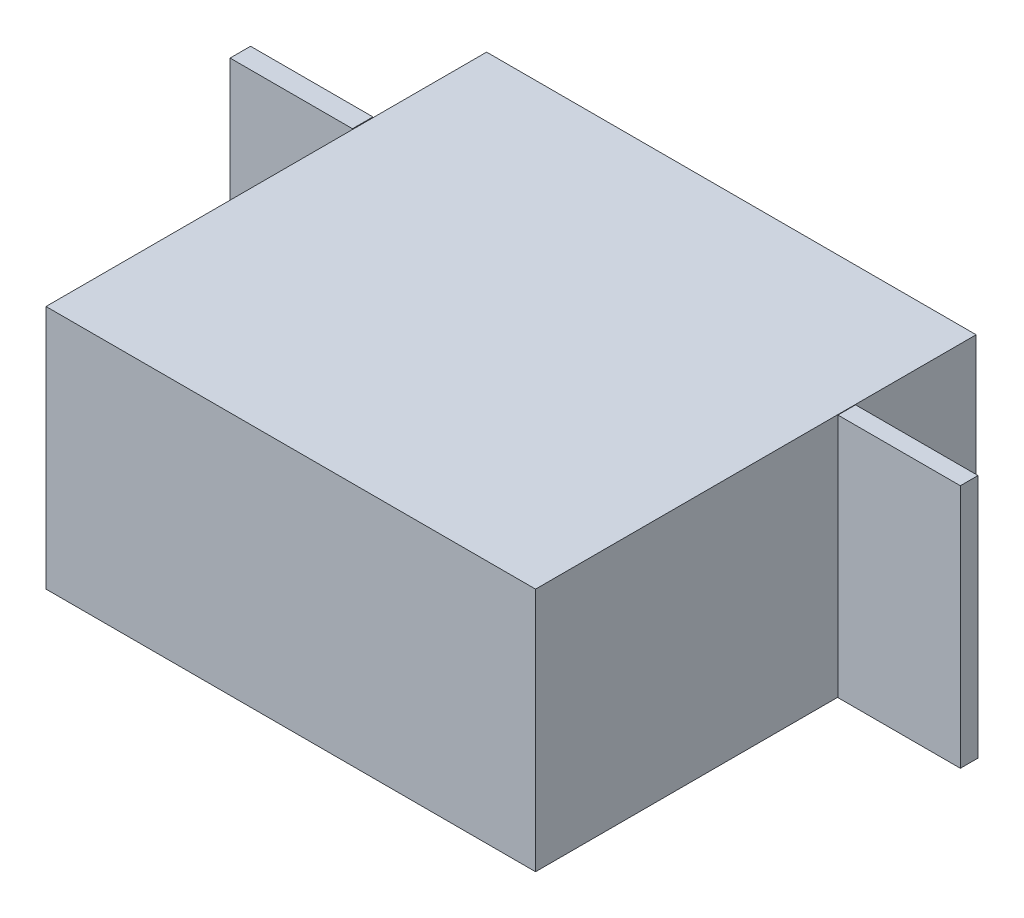
ISO-10303-21;
HEADER;
FILE_DESCRIPTION(('STEP AP214'),'2;1');
FILE_NAME('part.step','',(''),(''),'','','');
FILE_SCHEMA(('AUTOMOTIVE_DESIGN { 1 0 10303 214 1 1 1 1 }'));
ENDSEC;
DATA;
#1=APPLICATION_CONTEXT('core data for automotive mechanical design processes');
#2=APPLICATION_PROTOCOL_DEFINITION('international standard','automotive_design',2000,#1);
#3=PRODUCT_CONTEXT('',#1,'mechanical');
#4=PRODUCT('Part','Part','',(#3));
#5=PRODUCT_RELATED_PRODUCT_CATEGORY('part','',(#4));
#6=PRODUCT_DEFINITION_FORMATION('','',#4);
#7=PRODUCT_DEFINITION_CONTEXT('part definition',#1,'design');
#8=PRODUCT_DEFINITION('design','',#6,#7);
#9=PRODUCT_DEFINITION_SHAPE('','',#8);
#10=(LENGTH_UNIT() NAMED_UNIT(*) SI_UNIT(.MILLI.,.METRE.));
#11=(NAMED_UNIT(*) PLANE_ANGLE_UNIT() SI_UNIT($,.RADIAN.));
#12=(NAMED_UNIT(*) SI_UNIT($,.STERADIAN.) SOLID_ANGLE_UNIT());
#13=UNCERTAINTY_MEASURE_WITH_UNIT(LENGTH_MEASURE(1.E-05),#10,'distance_accuracy_value','');
#14=(GEOMETRIC_REPRESENTATION_CONTEXT(3) GLOBAL_UNCERTAINTY_ASSIGNED_CONTEXT((#13)) GLOBAL_UNIT_ASSIGNED_CONTEXT((#10,
#11,#12)) REPRESENTATION_CONTEXT('',''));
#15=CARTESIAN_POINT('',(0.,0.,0.));
#16=DIRECTION('',(0.,0.,1.));
#17=DIRECTION('',(1.,0.,0.));
#18=AXIS2_PLACEMENT_3D('',#15,#16,#17);
#19=CARTESIAN_POINT('',(-365.40350877193,-231.771929824561,-36.));
#20=DIRECTION('',(-1.,0.,0.));
#21=DIRECTION('',(0.,-1.,0.));
#22=AXIS2_PLACEMENT_3D('',#19,#20,#21);
#23=PLANE('',#22);
#24=DIRECTION('',(0.,-1.,0.));
#25=VECTOR('',#24,1.);
#26=CARTESIAN_POINT('',(-365.40350877193,-251.714058126937,-26.713842511615));
#27=LINE('',#26,#25);
#28=CARTESIAN_POINT('',(-365.40350877193,-231.771929824561,-26.713842511615));
#29=VERTEX_POINT('',#28);
#30=CARTESIAN_POINT('',(-365.40350877193,-251.714058126937,-26.713842511615));
#31=VERTEX_POINT('',#30);
#32=EDGE_CURVE('E162',#29,#31,#27,.T.);
#33=ORIENTED_EDGE('',*,*,#32,.F.);
#34=DIRECTION('',(0.,0.,1.));
#35=VECTOR('',#34,1.);
#36=CARTESIAN_POINT('',(-365.40350877193,-231.771929824561,-36.));
#37=LINE('',#36,#35);
#38=CARTESIAN_POINT('',(-365.40350877193,-231.771929824561,-36.));
#39=VERTEX_POINT('',#38);
#40=EDGE_CURVE('E221',#39,#29,#37,.T.);
#41=ORIENTED_EDGE('',*,*,#40,.F.);
#42=DIRECTION('',(0.,-1.,0.));
#43=VECTOR('',#42,1.);
#44=CARTESIAN_POINT('',(-365.40350877193,-231.771929824561,-36.));
#45=LINE('',#44,#43);
#46=CARTESIAN_POINT('',(-365.40350877193,-251.771929824561,-36.));
#47=VERTEX_POINT('',#46);
#48=EDGE_CURVE('E197',#39,#47,#45,.T.);
#49=ORIENTED_EDGE('',*,*,#48,.T.);
#50=DIRECTION('',(0.,0.,1.));
#51=VECTOR('',#50,1.);
#52=CARTESIAN_POINT('',(-365.40350877193,-251.771929824561,-36.));
#53=LINE('',#52,#51);
#54=CARTESIAN_POINT('',(-365.40350877193,-251.771929824561,0.));
#55=VERTEX_POINT('',#54);
#56=EDGE_CURVE('E210',#47,#55,#53,.T.);
#57=ORIENTED_EDGE('',*,*,#56,.T.);
#58=DIRECTION('',(0.,-1.,0.));
#59=VECTOR('',#58,1.);
#60=CARTESIAN_POINT('',(-365.40350877193,-231.771929824561,0.));
#61=LINE('',#60,#59);
#62=CARTESIAN_POINT('',(-365.40350877193,-231.771929824561,0.));
#63=VERTEX_POINT('',#62);
#64=EDGE_CURVE('E196',#63,#55,#61,.T.);
#65=ORIENTED_EDGE('',*,*,#64,.F.);
#66=CARTESIAN_POINT('',(-365.40350877193,-231.771929824561,-25.0419820591538));
#67=VERTEX_POINT('',#66);
#68=EDGE_CURVE('E225',#67,#63,#37,.T.);
#69=ORIENTED_EDGE('',*,*,#68,.F.);
#70=DIRECTION('',(0.,1.,0.));
#71=VECTOR('',#70,1.);
#72=CARTESIAN_POINT('',(-365.40350877193,-251.714058126937,-25.0419820591538));
#73=LINE('',#72,#71);
#74=CARTESIAN_POINT('',(-365.40350877193,-251.714058126937,-25.0419820591538));
#75=VERTEX_POINT('',#74);
#76=EDGE_CURVE('E181',#75,#67,#73,.T.);
#77=ORIENTED_EDGE('',*,*,#76,.F.);
#78=DIRECTION('',(0.,0.,1.));
#79=VECTOR('',#78,1.);
#80=CARTESIAN_POINT('',(-365.40350877193,-251.714058126937,-26.713842511615));
#81=LINE('',#80,#79);
#82=EDGE_CURVE('E160',#31,#75,#81,.T.);
#83=ORIENTED_EDGE('',*,*,#82,.F.);
#84=EDGE_LOOP('',(#33,#41,#49,#57,#65,#69,#77,#83));
#85=FACE_BOUND('',#84,.T.);
#86=ADVANCED_FACE('F33',(#85),#23,.T.);
#87=CARTESIAN_POINT('',(-365.40350877193,-231.771929824561,-36.));
#88=DIRECTION('',(0.,1.,0.));
#89=DIRECTION('',(0.,0.,1.));
#90=AXIS2_PLACEMENT_3D('',#87,#88,#89);
#91=PLANE('',#90);
#92=DIRECTION('',(-1.,0.,0.));
#93=VECTOR('',#92,1.);
#94=CARTESIAN_POINT('',(-365.40350877193,-231.771929824561,0.));
#95=LINE('',#94,#93);
#96=CARTESIAN_POINT('',(-325.40350877193,-231.771929824561,0.));
#97=VERTEX_POINT('',#96);
#98=EDGE_CURVE('E201',#97,#63,#95,.T.);
#99=ORIENTED_EDGE('',*,*,#98,.F.);
#100=DIRECTION('',(0.,0.,1.));
#101=VECTOR('',#100,1.);
#102=CARTESIAN_POINT('',(-325.40350877193,-231.771929824561,-36.));
#103=LINE('',#102,#101);
#104=CARTESIAN_POINT('',(-325.40350877193,-231.771929824561,-36.));
#105=VERTEX_POINT('',#104);
#106=EDGE_CURVE('E226',#105,#97,#103,.T.);
#107=ORIENTED_EDGE('',*,*,#106,.F.);
#108=DIRECTION('',(-1.,0.,0.));
#109=VECTOR('',#108,1.);
#110=CARTESIAN_POINT('',(-365.40350877193,-231.771929824561,-36.));
#111=LINE('',#110,#109);
#112=EDGE_CURVE('E207',#105,#39,#111,.T.);
#113=ORIENTED_EDGE('',*,*,#112,.T.);
#114=ORIENTED_EDGE('',*,*,#40,.T.);
#115=EDGE_CURVE('E224',#29,#67,#37,.T.);
#116=ORIENTED_EDGE('',*,*,#115,.T.);
#117=ORIENTED_EDGE('',*,*,#68,.T.);
#118=EDGE_LOOP('',(#99,#107,#113,#114,#116,#117));
#119=FACE_BOUND('',#118,.T.);
#120=ADVANCED_FACE('F282',(#119),#91,.T.);
#121=CARTESIAN_POINT('',(-325.40350877193,-231.771929824561,-36.));
#122=DIRECTION('',(1.,0.,0.));
#123=DIRECTION('',(0.,1.,0.));
#124=AXIS2_PLACEMENT_3D('',#121,#122,#123);
#125=PLANE('',#124);
#126=DIRECTION('',(0.,-1.,0.));
#127=VECTOR('',#126,1.);
#128=CARTESIAN_POINT('',(-325.40350877193,-251.805469910062,-24.7085041885073));
#129=LINE('',#128,#127);
#130=CARTESIAN_POINT('',(-325.40350877193,-231.809458984573,-24.7085041885073));
#131=VERTEX_POINT('',#130);
#132=CARTESIAN_POINT('',(-325.40350877193,-251.771929824561,-24.7085041885073));
#133=VERTEX_POINT('',#132);
#134=EDGE_CURVE('E47',#131,#133,#129,.T.);
#135=ORIENTED_EDGE('',*,*,#134,.F.);
#136=DIRECTION('',(0.,0.,1.));
#137=VECTOR('',#136,1.);
#138=CARTESIAN_POINT('',(-325.40350877193,-231.809458984573,-24.7085041885073));
#139=LINE('',#138,#137);
#140=CARTESIAN_POINT('',(-325.40350877193,-231.809458984573,-26.1509732101475));
#141=VERTEX_POINT('',#140);
#142=EDGE_CURVE('E151',#141,#131,#139,.T.);
#143=ORIENTED_EDGE('',*,*,#142,.F.);
#144=DIRECTION('',(0.,1.,0.));
#145=VECTOR('',#144,1.);
#146=CARTESIAN_POINT('',(-325.40350877193,-251.805469910062,-26.1509732101475));
#147=LINE('',#146,#145);
#148=CARTESIAN_POINT('',(-325.40350877193,-251.771929824561,-26.1509732101475));
#149=VERTEX_POINT('',#148);
#150=EDGE_CURVE('E40',#149,#141,#147,.T.);
#151=ORIENTED_EDGE('',*,*,#150,.F.);
#152=DIRECTION('',(0.,0.,1.));
#153=VECTOR('',#152,1.);
#154=CARTESIAN_POINT('',(-325.40350877193,-251.771929824561,-36.));
#155=LINE('',#154,#153);
#156=CARTESIAN_POINT('',(-325.40350877193,-251.771929824561,-36.));
#157=VERTEX_POINT('',#156);
#158=EDGE_CURVE('E228',#157,#149,#155,.T.);
#159=ORIENTED_EDGE('',*,*,#158,.F.);
#160=DIRECTION('',(0.,1.,0.));
#161=VECTOR('',#160,1.);
#162=CARTESIAN_POINT('',(-325.40350877193,-231.771929824561,-36.));
#163=LINE('',#162,#161);
#164=EDGE_CURVE('E204',#157,#105,#163,.T.);
#165=ORIENTED_EDGE('',*,*,#164,.T.);
#166=ORIENTED_EDGE('',*,*,#106,.T.);
#167=DIRECTION('',(0.,1.,0.));
#168=VECTOR('',#167,1.);
#169=CARTESIAN_POINT('',(-325.40350877193,-231.771929824561,0.));
#170=LINE('',#169,#168);
#171=CARTESIAN_POINT('',(-325.40350877193,-251.771929824561,0.));
#172=VERTEX_POINT('',#171);
#173=EDGE_CURVE('E216',#172,#97,#170,.T.);
#174=ORIENTED_EDGE('',*,*,#173,.F.);
#175=EDGE_CURVE('E52',#133,#172,#155,.T.);
#176=ORIENTED_EDGE('',*,*,#175,.F.);
#177=EDGE_LOOP('',(#135,#143,#151,#159,#165,#166,#174,#176));
#178=FACE_BOUND('',#177,.T.);
#179=ADVANCED_FACE('F285',(#178),#125,.T.);
#180=CARTESIAN_POINT('',(-365.40350877193,-251.771929824561,-36.));
#181=DIRECTION('',(0.,-1.,0.));
#182=DIRECTION('',(0.,0.,-1.));
#183=AXIS2_PLACEMENT_3D('',#180,#181,#182);
#184=PLANE('',#183);
#185=DIRECTION('',(1.,0.,0.));
#186=VECTOR('',#185,1.);
#187=CARTESIAN_POINT('',(-365.40350877193,-251.771929824561,0.));
#188=LINE('',#187,#186);
#189=EDGE_CURVE('E213',#55,#172,#188,.T.);
#190=ORIENTED_EDGE('',*,*,#189,.F.);
#191=ORIENTED_EDGE('',*,*,#56,.F.);
#192=DIRECTION('',(1.,0.,0.));
#193=VECTOR('',#192,1.);
#194=CARTESIAN_POINT('',(-365.40350877193,-251.771929824561,-36.));
#195=LINE('',#194,#193);
#196=EDGE_CURVE('E200',#47,#157,#195,.T.);
#197=ORIENTED_EDGE('',*,*,#196,.T.);
#198=ORIENTED_EDGE('',*,*,#158,.T.);
#199=EDGE_CURVE('E230',#149,#133,#155,.T.);
#200=ORIENTED_EDGE('',*,*,#199,.T.);
#201=ORIENTED_EDGE('',*,*,#175,.T.);
#202=EDGE_LOOP('',(#190,#191,#197,#198,#200,#201));
#203=FACE_BOUND('',#202,.T.);
#204=ADVANCED_FACE('F236',(#203),#184,.T.);
#205=CARTESIAN_POINT('',(0.,0.,-36.));
#206=DIRECTION('',(0.,0.,1.));
#207=DIRECTION('',(1.,0.,0.));
#208=AXIS2_PLACEMENT_3D('',#205,#206,#207);
#209=PLANE('',#208);
#210=CARTESIAN_POINT('',(-335.534633052604,-241.589611366126,-36.));
#211=DIRECTION('',(0.,0.,1.));
#212=DIRECTION('',(1.,0.,0.));
#213=AXIS2_PLACEMENT_3D('',#210,#211,#212);
#214=CIRCLE('',#213,6.50000000000002);
#215=CARTESIAN_POINT('',(-329.034633052604,-241.589611366126,-36.));
#216=VERTEX_POINT('',#215);
#217=EDGE_CURVE('E11',#216,#216,#214,.F.);
#218=ORIENTED_EDGE('',*,*,#217,.F.);
#219=EDGE_LOOP('',(#218));
#220=FACE_BOUND('',#219,.T.);
#221=ORIENTED_EDGE('',*,*,#48,.F.);
#222=ORIENTED_EDGE('',*,*,#112,.F.);
#223=ORIENTED_EDGE('',*,*,#164,.F.);
#224=ORIENTED_EDGE('',*,*,#196,.F.);
#225=EDGE_LOOP('',(#221,#222,#223,#224));
#226=FACE_BOUND('',#225,.T.);
#227=ADVANCED_FACE('F290',(#220,#226),#209,.F.);
#228=CARTESIAN_POINT('',(0.,0.,0.));
#229=DIRECTION('',(0.,0.,1.));
#230=DIRECTION('',(1.,0.,0.));
#231=AXIS2_PLACEMENT_3D('',#228,#229,#230);
#232=PLANE('',#231);
#233=ORIENTED_EDGE('',*,*,#64,.T.);
#234=ORIENTED_EDGE('',*,*,#189,.T.);
#235=ORIENTED_EDGE('',*,*,#173,.T.);
#236=ORIENTED_EDGE('',*,*,#98,.T.);
#237=EDGE_LOOP('',(#233,#234,#235,#236));
#238=FACE_BOUND('',#237,.T.);
#239=ADVANCED_FACE('F284',(#238),#232,.T.);
#240=CARTESIAN_POINT('',(-365.40350877193,-1.01419847179355E-12,0.));
#241=DIRECTION('',(1.,0.,0.));
#242=DIRECTION('',(0.,1.,0.));
#243=AXIS2_PLACEMENT_3D('',#240,#241,#242);
#244=PLANE('',#243);
#245=ORIENTED_EDGE('',*,*,#115,.F.);
#246=CARTESIAN_POINT('',(-365.40350877193,-231.714058126937,-26.713842511615));
#247=VERTEX_POINT('',#246);
#248=EDGE_CURVE('E157',#247,#29,#27,.T.);
#249=ORIENTED_EDGE('',*,*,#248,.F.);
#250=DIRECTION('',(0.,0.,-1.));
#251=VECTOR('',#250,1.);
#252=CARTESIAN_POINT('',(-365.40350877193,-231.714058126937,-26.713842511615));
#253=LINE('',#252,#251);
#254=CARTESIAN_POINT('',(-365.40350877193,-231.714058126937,-25.0419820591538));
#255=VERTEX_POINT('',#254);
#256=EDGE_CURVE('E171',#255,#247,#253,.T.);
#257=ORIENTED_EDGE('',*,*,#256,.F.);
#258=EDGE_CURVE('E180',#67,#255,#73,.T.);
#259=ORIENTED_EDGE('',*,*,#258,.F.);
#260=EDGE_LOOP('',(#245,#249,#257,#259));
#261=FACE_BOUND('',#260,.T.);
#262=ADVANCED_FACE('F277',(#261),#244,.T.);
#263=CARTESIAN_POINT('',(-375.40350877193,-251.714058126937,-26.713842511615));
#264=DIRECTION('',(0.,0.,1.));
#265=DIRECTION('',(1.,0.,0.));
#266=AXIS2_PLACEMENT_3D('',#263,#264,#265);
#267=PLANE('',#266);
#268=ORIENTED_EDGE('',*,*,#248,.T.);
#269=ORIENTED_EDGE('',*,*,#32,.T.);
#270=DIRECTION('',(1.,0.,0.));
#271=VECTOR('',#270,1.);
#272=CARTESIAN_POINT('',(-375.40350877193,-251.714058126937,-26.713842511615));
#273=LINE('',#272,#271);
#274=CARTESIAN_POINT('',(-375.40350877193,-251.714058126937,-26.713842511615));
#275=VERTEX_POINT('',#274);
#276=EDGE_CURVE('E193',#275,#31,#273,.T.);
#277=ORIENTED_EDGE('',*,*,#276,.F.);
#278=DIRECTION('',(0.,-1.,0.));
#279=VECTOR('',#278,1.);
#280=CARTESIAN_POINT('',(-375.40350877193,-251.714058126937,-26.713842511615));
#281=LINE('',#280,#279);
#282=CARTESIAN_POINT('',(-375.40350877193,-231.714058126937,-26.713842511615));
#283=VERTEX_POINT('',#282);
#284=EDGE_CURVE('E167',#283,#275,#281,.T.);
#285=ORIENTED_EDGE('',*,*,#284,.F.);
#286=DIRECTION('',(1.,0.,0.));
#287=VECTOR('',#286,1.);
#288=CARTESIAN_POINT('',(-375.40350877193,-231.714058126937,-26.713842511615));
#289=LINE('',#288,#287);
#290=EDGE_CURVE('E176',#283,#247,#289,.T.);
#291=ORIENTED_EDGE('',*,*,#290,.T.);
#292=EDGE_LOOP('',(#268,#269,#277,#285,#291));
#293=FACE_BOUND('',#292,.T.);
#294=ADVANCED_FACE('F262',(#293),#267,.F.);
#295=CARTESIAN_POINT('',(-375.40350877193,-251.714058126937,-26.713842511615));
#296=DIRECTION('',(0.,1.,0.));
#297=DIRECTION('',(-1.,0.,0.));
#298=AXIS2_PLACEMENT_3D('',#295,#296,#297);
#299=PLANE('',#298);
#300=ORIENTED_EDGE('',*,*,#82,.T.);
#301=DIRECTION('',(1.,0.,0.));
#302=VECTOR('',#301,1.);
#303=CARTESIAN_POINT('',(-375.40350877193,-251.714058126937,-25.0419820591538));
#304=LINE('',#303,#302);
#305=CARTESIAN_POINT('',(-375.40350877193,-251.714058126937,-25.0419820591538));
#306=VERTEX_POINT('',#305);
#307=EDGE_CURVE('E190',#306,#75,#304,.T.);
#308=ORIENTED_EDGE('',*,*,#307,.F.);
#309=DIRECTION('',(0.,0.,1.));
#310=VECTOR('',#309,1.);
#311=CARTESIAN_POINT('',(-375.40350877193,-251.714058126937,-26.713842511615));
#312=LINE('',#311,#310);
#313=EDGE_CURVE('E170',#275,#306,#312,.T.);
#314=ORIENTED_EDGE('',*,*,#313,.F.);
#315=ORIENTED_EDGE('',*,*,#276,.T.);
#316=EDGE_LOOP('',(#300,#308,#314,#315));
#317=FACE_BOUND('',#316,.T.);
#318=ADVANCED_FACE('F266',(#317),#299,.F.);
#319=CARTESIAN_POINT('',(-375.40350877193,-251.714058126937,-25.0419820591538));
#320=DIRECTION('',(0.,0.,-1.));
#321=DIRECTION('',(-1.,0.,0.));
#322=AXIS2_PLACEMENT_3D('',#319,#320,#321);
#323=PLANE('',#322);
#324=ORIENTED_EDGE('',*,*,#76,.T.);
#325=ORIENTED_EDGE('',*,*,#258,.T.);
#326=DIRECTION('',(1.,0.,0.));
#327=VECTOR('',#326,1.);
#328=CARTESIAN_POINT('',(-375.40350877193,-231.714058126937,-25.0419820591538));
#329=LINE('',#328,#327);
#330=CARTESIAN_POINT('',(-375.40350877193,-231.714058126937,-25.0419820591538));
#331=VERTEX_POINT('',#330);
#332=EDGE_CURVE('E187',#331,#255,#329,.T.);
#333=ORIENTED_EDGE('',*,*,#332,.F.);
#334=DIRECTION('',(0.,1.,0.));
#335=VECTOR('',#334,1.);
#336=CARTESIAN_POINT('',(-375.40350877193,-251.714058126937,-25.0419820591538));
#337=LINE('',#336,#335);
#338=EDGE_CURVE('E173',#306,#331,#337,.T.);
#339=ORIENTED_EDGE('',*,*,#338,.F.);
#340=ORIENTED_EDGE('',*,*,#307,.T.);
#341=EDGE_LOOP('',(#324,#325,#333,#339,#340));
#342=FACE_BOUND('',#341,.T.);
#343=ADVANCED_FACE('F405',(#342),#323,.F.);
#344=CARTESIAN_POINT('',(-375.40350877193,-231.714058126937,-26.713842511615));
#345=DIRECTION('',(0.,-1.,0.));
#346=DIRECTION('',(1.,0.,0.));
#347=AXIS2_PLACEMENT_3D('',#344,#345,#346);
#348=PLANE('',#347);
#349=ORIENTED_EDGE('',*,*,#256,.T.);
#350=ORIENTED_EDGE('',*,*,#290,.F.);
#351=DIRECTION('',(0.,0.,-1.));
#352=VECTOR('',#351,1.);
#353=CARTESIAN_POINT('',(-375.40350877193,-231.714058126937,-26.713842511615));
#354=LINE('',#353,#352);
#355=EDGE_CURVE('E175',#331,#283,#354,.T.);
#356=ORIENTED_EDGE('',*,*,#355,.F.);
#357=ORIENTED_EDGE('',*,*,#332,.T.);
#358=EDGE_LOOP('',(#349,#350,#356,#357));
#359=FACE_BOUND('',#358,.T.);
#360=ADVANCED_FACE('F400',(#359),#348,.F.);
#361=CARTESIAN_POINT('',(-375.40350877193,-1.04195404740917E-12,0.));
#362=DIRECTION('',(1.,0.,0.));
#363=DIRECTION('',(0.,1.,0.));
#364=AXIS2_PLACEMENT_3D('',#361,#362,#363);
#365=PLANE('',#364);
#366=ORIENTED_EDGE('',*,*,#284,.T.);
#367=ORIENTED_EDGE('',*,*,#313,.T.);
#368=ORIENTED_EDGE('',*,*,#338,.T.);
#369=ORIENTED_EDGE('',*,*,#355,.T.);
#370=EDGE_LOOP('',(#366,#367,#368,#369));
#371=FACE_BOUND('',#370,.T.);
#372=ADVANCED_FACE('F270',(#371),#365,.F.);
#373=CARTESIAN_POINT('',(-325.403508771931,-1.80671269423993E-12,0.));
#374=DIRECTION('',(-1.,0.,0.));
#375=DIRECTION('',(0.,-1.,0.));
#376=AXIS2_PLACEMENT_3D('',#373,#374,#375);
#377=PLANE('',#376);
#378=ORIENTED_EDGE('',*,*,#199,.F.);
#379=CARTESIAN_POINT('',(-325.40350877193,-251.805469910062,-26.1509732101475));
#380=VERTEX_POINT('',#379);
#381=EDGE_CURVE('E245',#380,#149,#147,.T.);
#382=ORIENTED_EDGE('',*,*,#381,.F.);
#383=DIRECTION('',(0.,0.,-1.));
#384=VECTOR('',#383,1.);
#385=CARTESIAN_POINT('',(-325.40350877193,-251.805469910062,-24.7085041885073));
#386=LINE('',#385,#384);
#387=CARTESIAN_POINT('',(-325.40350877193,-251.805469910062,-24.7085041885073));
#388=VERTEX_POINT('',#387);
#389=EDGE_CURVE('E241',#388,#380,#386,.T.);
#390=ORIENTED_EDGE('',*,*,#389,.F.);
#391=EDGE_CURVE('E155',#133,#388,#129,.T.);
#392=ORIENTED_EDGE('',*,*,#391,.F.);
#393=EDGE_LOOP('',(#378,#382,#390,#392));
#394=FACE_BOUND('',#393,.T.);
#395=ADVANCED_FACE('F240',(#394),#377,.T.);
#396=CARTESIAN_POINT('',(-315.40350877193,-251.805469910062,-24.7085041885073));
#397=DIRECTION('',(0.,0.,-1.));
#398=DIRECTION('',(-1.,0.,0.));
#399=AXIS2_PLACEMENT_3D('',#396,#397,#398);
#400=PLANE('',#399);
#401=ORIENTED_EDGE('',*,*,#134,.T.);
#402=ORIENTED_EDGE('',*,*,#391,.T.);
#403=DIRECTION('',(-1.,0.,0.));
#404=VECTOR('',#403,1.);
#405=CARTESIAN_POINT('',(-315.40350877193,-251.805469910062,-24.7085041885073));
#406=LINE('',#405,#404);
#407=CARTESIAN_POINT('',(-315.40350877193,-251.805469910062,-24.7085041885073));
#408=VERTEX_POINT('',#407);
#409=EDGE_CURVE('E136',#408,#388,#406,.T.);
#410=ORIENTED_EDGE('',*,*,#409,.F.);
#411=DIRECTION('',(0.,-1.,0.));
#412=VECTOR('',#411,1.);
#413=CARTESIAN_POINT('',(-315.40350877193,-251.805469910062,-24.7085041885073));
#414=LINE('',#413,#412);
#415=CARTESIAN_POINT('',(-315.40350877193,-231.809458984573,-24.7085041885073));
#416=VERTEX_POINT('',#415);
#417=EDGE_CURVE('E142',#416,#408,#414,.T.);
#418=ORIENTED_EDGE('',*,*,#417,.F.);
#419=DIRECTION('',(-1.,0.,0.));
#420=VECTOR('',#419,1.);
#421=CARTESIAN_POINT('',(-315.40350877193,-231.809458984573,-24.7085041885073));
#422=LINE('',#421,#420);
#423=EDGE_CURVE('E244',#416,#131,#422,.T.);
#424=ORIENTED_EDGE('',*,*,#423,.T.);
#425=EDGE_LOOP('',(#401,#402,#410,#418,#424));
#426=FACE_BOUND('',#425,.T.);
#427=ADVANCED_FACE('F153',(#426),#400,.F.);
#428=CARTESIAN_POINT('',(-315.40350877193,-251.805469910062,-24.7085041885073));
#429=DIRECTION('',(0.,1.,0.));
#430=DIRECTION('',(-1.,0.,0.));
#431=AXIS2_PLACEMENT_3D('',#428,#429,#430);
#432=PLANE('',#431);
#433=ORIENTED_EDGE('',*,*,#389,.T.);
#434=DIRECTION('',(-1.,0.,0.));
#435=VECTOR('',#434,1.);
#436=CARTESIAN_POINT('',(-315.40350877193,-251.805469910062,-26.1509732101475));
#437=LINE('',#436,#435);
#438=CARTESIAN_POINT('',(-315.40350877193,-251.805469910062,-26.1509732101475));
#439=VERTEX_POINT('',#438);
#440=EDGE_CURVE('E138',#439,#380,#437,.T.);
#441=ORIENTED_EDGE('',*,*,#440,.F.);
#442=DIRECTION('',(0.,0.,-1.));
#443=VECTOR('',#442,1.);
#444=CARTESIAN_POINT('',(-315.40350877193,-251.805469910062,-24.7085041885073));
#445=LINE('',#444,#443);
#446=EDGE_CURVE('E132',#408,#439,#445,.T.);
#447=ORIENTED_EDGE('',*,*,#446,.F.);
#448=ORIENTED_EDGE('',*,*,#409,.T.);
#449=EDGE_LOOP('',(#433,#441,#447,#448));
#450=FACE_BOUND('',#449,.T.);
#451=ADVANCED_FACE('F134',(#450),#432,.F.);
#452=CARTESIAN_POINT('',(-315.40350877193,-251.805469910062,-26.1509732101475));
#453=DIRECTION('',(0.,0.,1.));
#454=DIRECTION('',(1.,0.,0.));
#455=AXIS2_PLACEMENT_3D('',#452,#453,#454);
#456=PLANE('',#455);
#457=ORIENTED_EDGE('',*,*,#381,.T.);
#458=ORIENTED_EDGE('',*,*,#150,.T.);
#459=DIRECTION('',(-1.,0.,0.));
#460=VECTOR('',#459,1.);
#461=CARTESIAN_POINT('',(-315.40350877193,-231.809458984573,-26.1509732101475));
#462=LINE('',#461,#460);
#463=CARTESIAN_POINT('',(-315.40350877193,-231.809458984573,-26.1509732101475));
#464=VERTEX_POINT('',#463);
#465=EDGE_CURVE('E163',#464,#141,#462,.T.);
#466=ORIENTED_EDGE('',*,*,#465,.F.);
#467=DIRECTION('',(0.,1.,0.));
#468=VECTOR('',#467,1.);
#469=CARTESIAN_POINT('',(-315.40350877193,-251.805469910062,-26.1509732101475));
#470=LINE('',#469,#468);
#471=EDGE_CURVE('E141',#439,#464,#470,.T.);
#472=ORIENTED_EDGE('',*,*,#471,.F.);
#473=ORIENTED_EDGE('',*,*,#440,.T.);
#474=EDGE_LOOP('',(#457,#458,#466,#472,#473));
#475=FACE_BOUND('',#474,.T.);
#476=ADVANCED_FACE('F258',(#475),#456,.F.);
#477=CARTESIAN_POINT('',(-315.40350877193,-231.809458984573,-24.7085041885073));
#478=DIRECTION('',(0.,-1.,0.));
#479=DIRECTION('',(1.,0.,0.));
#480=AXIS2_PLACEMENT_3D('',#477,#478,#479);
#481=PLANE('',#480);
#482=ORIENTED_EDGE('',*,*,#142,.T.);
#483=ORIENTED_EDGE('',*,*,#423,.F.);
#484=DIRECTION('',(0.,0.,1.));
#485=VECTOR('',#484,1.);
#486=CARTESIAN_POINT('',(-315.40350877193,-231.809458984573,-24.7085041885073));
#487=LINE('',#486,#485);
#488=EDGE_CURVE('E147',#464,#416,#487,.T.);
#489=ORIENTED_EDGE('',*,*,#488,.F.);
#490=ORIENTED_EDGE('',*,*,#465,.T.);
#491=EDGE_LOOP('',(#482,#483,#489,#490));
#492=FACE_BOUND('',#491,.T.);
#493=ADVANCED_FACE('F255',(#492),#481,.F.);
#494=CARTESIAN_POINT('',(-315.403508771931,-1.75120154300868E-12,0.));
#495=DIRECTION('',(-1.,0.,0.));
#496=DIRECTION('',(0.,-1.,0.));
#497=AXIS2_PLACEMENT_3D('',#494,#495,#496);
#498=PLANE('',#497);
#499=ORIENTED_EDGE('',*,*,#417,.T.);
#500=ORIENTED_EDGE('',*,*,#446,.T.);
#501=ORIENTED_EDGE('',*,*,#471,.T.);
#502=ORIENTED_EDGE('',*,*,#488,.T.);
#503=EDGE_LOOP('',(#499,#500,#501,#502));
#504=FACE_BOUND('',#503,.T.);
#505=ADVANCED_FACE('F145',(#504),#498,.F.);
#506=CARTESIAN_POINT('',(-335.534633052604,-241.589611366126,-38.0000000000014));
#507=DIRECTION('',(0.,0.,1.));
#508=DIRECTION('',(1.,0.,0.));
#509=AXIS2_PLACEMENT_3D('',#506,#507,#508);
#510=CYLINDRICAL_SURFACE('',#509,6.50000000000002);
#511=CARTESIAN_POINT('',(-335.534633052604,-241.589611366126,-38.0000000000014));
#512=DIRECTION('',(0.,0.,-1.));
#513=DIRECTION('',(-1.,0.,0.));
#514=AXIS2_PLACEMENT_3D('',#511,#512,#513);
#515=CIRCLE('',#514,6.50000000000002);
#516=CARTESIAN_POINT('',(-342.034633052604,-241.589611366126,-38.0000000000014));
#517=VERTEX_POINT('',#516);
#518=EDGE_CURVE('E242',#517,#517,#515,.T.);
#519=ORIENTED_EDGE('',*,*,#518,.F.);
#520=EDGE_LOOP('',(#519));
#521=FACE_BOUND('',#520,.T.);
#522=ORIENTED_EDGE('',*,*,#217,.T.);
#523=EDGE_LOOP('',(#522));
#524=FACE_BOUND('',#523,.T.);
#525=ADVANCED_FACE('F369',(#521,#524),#510,.T.);
#526=CARTESIAN_POINT('',(-335.534633052604,-241.589611366126,-38.0000000000014));
#527=DIRECTION('',(0.,0.,-1.));
#528=DIRECTION('',(-1.,0.,0.));
#529=AXIS2_PLACEMENT_3D('',#526,#527,#528);
#530=PLANE('',#529);
#531=ORIENTED_EDGE('',*,*,#518,.T.);
#532=EDGE_LOOP('',(#531));
#533=FACE_BOUND('',#532,.T.);
#534=ADVANCED_FACE('F383',(#533),#530,.T.);
#535=CLOSED_SHELL('',(#86,#120,#179,#204,#227,#239,#262,#294,#318,#343,#360,#372,#395,#427,#451,
#476,#493,#505,#525,#534));
#536=MANIFOLD_SOLID_BREP('B2',#535);
#537=ADVANCED_BREP_SHAPE_REPRESENTATION('',(#18,#536),#14);
#538=SHAPE_DEFINITION_REPRESENTATION(#9,#537);
ENDSEC;
END-ISO-10303-21;
